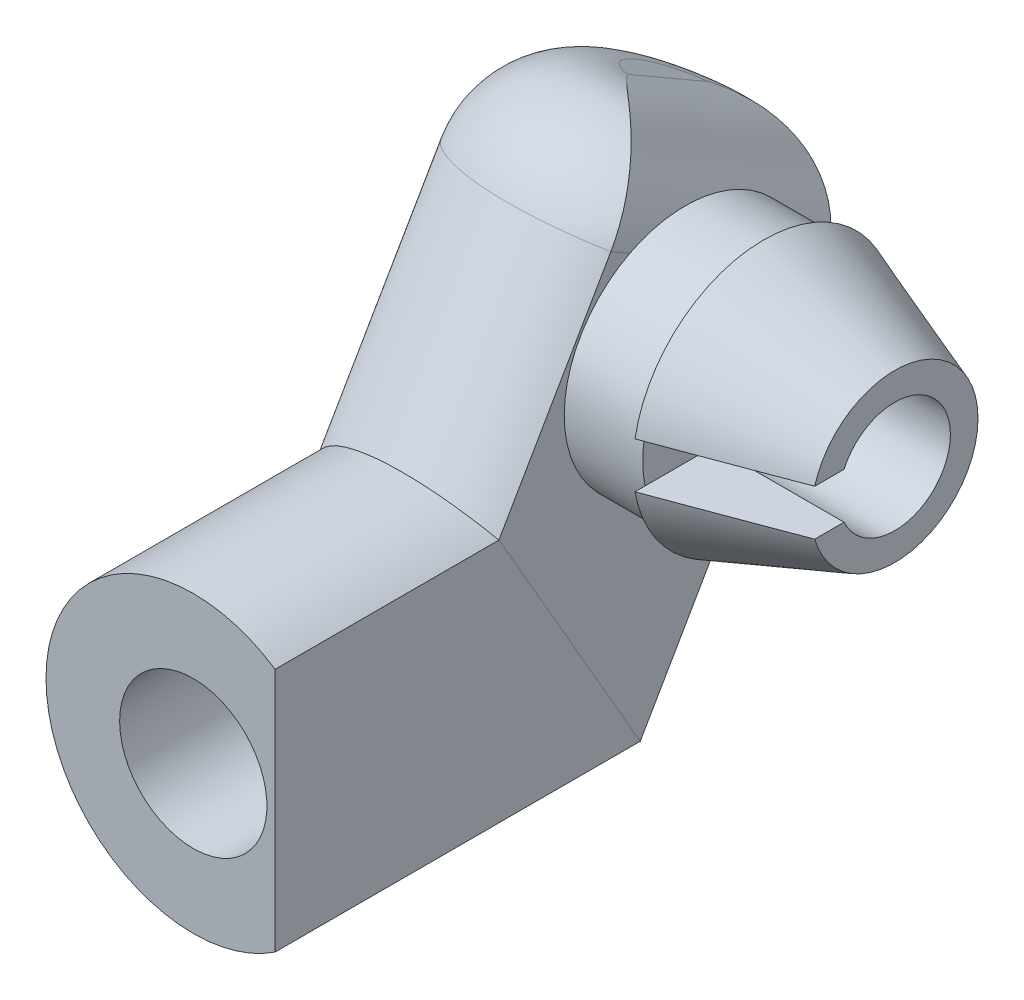
ISO-10303-21;
HEADER;
FILE_DESCRIPTION(('STEP AP214'),'2;1');
FILE_NAME('part.step','',(''),(''),'','','');
FILE_SCHEMA(('AUTOMOTIVE_DESIGN { 1 0 10303 214 1 1 1 1 }'));
ENDSEC;
DATA;
#1=APPLICATION_CONTEXT('core data for automotive mechanical design processes');
#2=APPLICATION_PROTOCOL_DEFINITION('international standard','automotive_design',2000,#1);
#3=PRODUCT_CONTEXT('',#1,'mechanical');
#4=PRODUCT('Part','Part','',(#3));
#5=PRODUCT_RELATED_PRODUCT_CATEGORY('part','',(#4));
#6=PRODUCT_DEFINITION_FORMATION('','',#4);
#7=PRODUCT_DEFINITION_CONTEXT('part definition',#1,'design');
#8=PRODUCT_DEFINITION('design','',#6,#7);
#9=PRODUCT_DEFINITION_SHAPE('','',#8);
#10=(LENGTH_UNIT() NAMED_UNIT(*) SI_UNIT(.MILLI.,.METRE.));
#11=(NAMED_UNIT(*) PLANE_ANGLE_UNIT() SI_UNIT($,.RADIAN.));
#12=(NAMED_UNIT(*) SI_UNIT($,.STERADIAN.) SOLID_ANGLE_UNIT());
#13=UNCERTAINTY_MEASURE_WITH_UNIT(LENGTH_MEASURE(1.E-05),#10,'distance_accuracy_value','');
#14=(GEOMETRIC_REPRESENTATION_CONTEXT(3) GLOBAL_UNCERTAINTY_ASSIGNED_CONTEXT((#13)) GLOBAL_UNIT_ASSIGNED_CONTEXT((#10,
#11,#12)) REPRESENTATION_CONTEXT('',''));
#15=CARTESIAN_POINT('',(0.,0.,0.));
#16=DIRECTION('',(0.,0.,1.));
#17=DIRECTION('',(1.,0.,0.));
#18=AXIS2_PLACEMENT_3D('',#15,#16,#17);
#19=CARTESIAN_POINT('',(-0.0500000000000001,3.02067456655205,-6.26803817760076));
#20=DIRECTION('',(-1.,0.,0.));
#21=DIRECTION('',(0.,0.,1.));
#22=AXIS2_PLACEMENT_3D('',#19,#20,#21);
#23=CONICAL_SURFACE('',#22,2.,0.349065850398867);
#24=CARTESIAN_POINT('',(-2.77462654516506,3.37067456655205,-3.29689917972266));
#25=CARTESIAN_POINT('',(-2.42327258892563,3.37067456655205,-3.42568369624412));
#26=CARTESIAN_POINT('',(-2.07194484779826,3.37067456655205,-3.55454031733741));
#27=CARTESIAN_POINT('',(-1.36933652030103,3.37067456655205,-3.81259219044382));
#28=CARTESIAN_POINT('',(-1.01805595625871,3.37067456655205,-3.9417875032339));
#29=CARTESIAN_POINT('',(-0.320755588125465,3.37067456655205,-4.19878810936494));
#30=CARTESIAN_POINT('',(0.0252667747236861,3.37067456655205,-4.32658645903285));
#31=CARTESIAN_POINT('',(0.716947069285238,3.37067456655205,-4.58297075605418));
#32=CARTESIAN_POINT('',(1.06260505689295,3.37067456655205,-4.71155655220202));
#33=CARTESIAN_POINT('',(1.57423764545681,3.37067456655205,-4.903302441866));
#34=CARTESIAN_POINT('',(1.74045362915212,3.37067456655205,-4.96581761402559));
#35=CARTESIAN_POINT('',(2.07273006817565,3.37067456655205,-5.09148460394503));
#36=CARTESIAN_POINT('',(2.23879042034326,3.37067456655205,-5.15463669461088));
#37=CARTESIAN_POINT('',(2.57206401364978,3.37067456655205,-5.282492884111));
#38=CARTESIAN_POINT('',(2.73927384959226,3.37067456655205,-5.34720590724439));
#39=CARTESIAN_POINT('',(2.9894349409236,3.37067456655205,-5.44559387680397));
#40=CARTESIAN_POINT('',(3.07265427580025,3.37067456655205,-5.47858575646397));
#41=CARTESIAN_POINT('',(3.2388235912935,3.37067456655205,-5.54523005579115));
#42=CARTESIAN_POINT('',(3.32177358518172,3.37067456655205,-5.57888244231845));
#43=CARTESIAN_POINT('',(3.4874112070593,3.37067456655205,-5.64723040605564));
#44=CARTESIAN_POINT('',(3.57009814885906,3.37067456655205,-5.68192766018844));
#45=CARTESIAN_POINT('',(3.69377870277282,3.37067456655205,-5.73527374953911));
#46=CARTESIAN_POINT('',(3.73503491387753,3.37067456655205,-5.75331237684576));
#47=CARTESIAN_POINT('',(3.817284757096,3.37067456655205,-5.78994035317764));
#48=CARTESIAN_POINT('',(3.85827847972579,3.37067456655205,-5.80852949837127));
#49=CARTESIAN_POINT('',(3.9395704272291,3.37067456655205,-5.846317114133));
#50=CARTESIAN_POINT('',(3.97987160149362,3.37067456655205,-5.8655091854921));
#51=CARTESIAN_POINT('',(4.0599880505479,3.37067456655205,-5.9050212650404));
#52=CARTESIAN_POINT('',(4.09980257324385,3.37067456655205,-5.92534280187353));
#53=CARTESIAN_POINT('',(4.17825835181021,3.37067456655205,-5.96753280145386));
#54=CARTESIAN_POINT('',(4.21690604754658,3.37067456655205,-5.98938889887413));
#55=CARTESIAN_POINT('',(4.27348651661276,3.37067456655205,-6.0243470330819));
#56=CARTESIAN_POINT('',(4.29209482330612,3.37067456655205,-6.03634746848563));
#57=CARTESIAN_POINT('',(4.32860163615551,3.37067456655205,-6.06137530225531));
#58=CARTESIAN_POINT('',(4.34650067069913,3.37067456655205,-6.07440191367749));
#59=CARTESIAN_POINT('',(4.37266762940358,3.37067456655205,-6.0952438020877));
#60=CARTESIAN_POINT('',(4.38137347883515,3.37067456655205,-6.10250047099872));
#61=CARTESIAN_POINT('',(4.39834568911806,3.37067456655205,-6.11751342505952));
#62=CARTESIAN_POINT('',(4.40661153645898,3.37067456655205,-6.12527027158118));
#63=CARTESIAN_POINT('',(4.43036122700317,3.37067456655205,-6.14931373814886));
#64=CARTESIAN_POINT('',(4.44502118904501,3.37067456655205,-6.16654028836408));
#65=CARTESIAN_POINT('',(4.46151129646433,3.37067456655205,-6.19272675923471));
#66=CARTESIAN_POINT('',(4.4656643047225,3.37067456655205,-6.20019908811757));
#67=CARTESIAN_POINT('',(4.47286224188125,3.37067456655205,-6.21567538133807));
#68=CARTESIAN_POINT('',(4.47590720160265,3.37067456655205,-6.22367933088114));
#69=CARTESIAN_POINT('',(4.4805723080935,3.37067456655205,-6.24022212777529));
#70=CARTESIAN_POINT('',(4.48217325211873,3.37067456655205,-6.24876661200323));
#71=CARTESIAN_POINT('',(4.48361123583205,3.37067456655205,-6.26599963561359));
#72=CARTESIAN_POINT('',(4.48345061030803,3.37067456655205,-6.27468796908174));
#73=CARTESIAN_POINT('',(4.4815532706528,3.37067456655205,-6.29060394083571));
#74=CARTESIAN_POINT('',(4.48004782931275,3.37067456655205,-6.29786112221742));
#75=CARTESIAN_POINT('',(4.4759551246222,3.37067456655205,-6.31206214229679));
#76=CARTESIAN_POINT('',(4.47336682262463,3.37067456655205,-6.31900567304669));
#77=CARTESIAN_POINT('',(4.46535972694491,3.37067456655205,-6.33692216003942));
#78=CARTESIAN_POINT('',(4.45919710046404,3.37067456655205,-6.34755822343045));
#79=CARTESIAN_POINT('',(4.44538949320498,3.37067456655205,-6.36781845957667));
#80=CARTESIAN_POINT('',(4.43773925250148,3.37067456655205,-6.37743884917097));
#81=CARTESIAN_POINT('',(4.41771854908501,3.37067456655205,-6.40014850378801));
#82=CARTESIAN_POINT('',(4.40481281814124,3.37067456655205,-6.4127581723934));
#83=CARTESIAN_POINT('',(4.37788317812015,3.37067456655205,-6.43673855036823));
#84=CARTESIAN_POINT('',(4.36385657075129,3.37067456655205,-6.44810610390274));
#85=CARTESIAN_POINT('',(4.3350301514679,3.37067456655205,-6.47000930524335));
#86=CARTESIAN_POINT('',(4.32022590152338,3.37067456655205,-6.48053905738128));
#87=CARTESIAN_POINT('',(4.29018172422201,3.37067456655205,-6.50090657979079));
#88=CARTESIAN_POINT('',(4.2749423670518,3.37067456655205,-6.5107452020479));
#89=CARTESIAN_POINT('',(4.22460752621657,3.37067456655205,-6.54208686697669));
#90=CARTESIAN_POINT('',(4.18886345247389,3.37067456655205,-6.56254269267113));
#91=CARTESIAN_POINT('',(4.11654066960701,3.37067456655205,-6.60193216218318));
#92=CARTESIAN_POINT('',(4.0799614366747,3.37067456655205,-6.62086481501814));
#93=CARTESIAN_POINT('',(4.00622513665027,3.37067456655205,-6.65774948835564));
#94=CARTESIAN_POINT('',(3.96906709358234,3.37067456655205,-6.67569955292643));
#95=CARTESIAN_POINT('',(3.8944141347352,3.37067456655205,-6.71088727210513));
#96=CARTESIAN_POINT('',(3.85691919061602,3.37067456655205,-6.72812486608421));
#97=CARTESIAN_POINT('',(3.74425023757635,3.37067456655205,-6.77899353817693));
#98=CARTESIAN_POINT('',(3.66873116577695,3.37067456655205,-6.81185852034386));
#99=CARTESIAN_POINT('',(3.51727780296116,3.37067456655205,-6.87634609856422));
#100=CARTESIAN_POINT('',(3.44134411964462,3.37067456655205,-6.90797013949984));
#101=CARTESIAN_POINT('',(3.21402014676534,3.37067456655205,-7.00130223386729));
#102=CARTESIAN_POINT('',(3.06216634023453,3.37067456655205,-7.06187870590303));
#103=CARTESIAN_POINT('',(2.75787483568222,3.37067456655205,-7.18155314886679));
#104=CARTESIAN_POINT('',(2.60543710656806,3.37067456655205,-7.24065103976518));
#105=CARTESIAN_POINT('',(2.30013700556098,3.37067456655205,-7.35799817813714));
#106=CARTESIAN_POINT('',(2.14727444339837,3.37067456655205,-7.41624693084861));
#107=CARTESIAN_POINT('',(1.84134250341777,3.37067456655205,-7.53218645476202));
#108=CARTESIAN_POINT('',(1.68827313043809,3.37067456655205,-7.58987723876851));
#109=CARTESIAN_POINT('',(1.22906188063726,3.37067456655205,-7.76232047213126));
#110=CARTESIAN_POINT('',(0.922713029999243,3.37067456655205,-7.87652147033408));
#111=CARTESIAN_POINT('',(0.309789353610408,3.37067456655205,-8.10415745068491));
#112=CARTESIAN_POINT('',(0.00321457364096272,3.37067456655205,-8.21759255646171));
#113=CARTESIAN_POINT('',(-0.419257648315761,3.37067456655205,-8.37355671615143));
#114=CARTESIAN_POINT('',(-0.535083549104995,3.37067456655205,-8.41627955675354));
#115=CARTESIAN_POINT('',(-0.766759649561241,3.37067456655205,-8.50167204948504));
#116=CARTESIAN_POINT('',(-0.882609849948039,3.37067456655205,-8.54434169966138));
#117=CARTESIAN_POINT('',(-1.1143499201964,3.37067456655205,-8.62964347735423));
#118=CARTESIAN_POINT('',(-1.23023979337941,3.37067456655205,-8.67227559584663));
#119=CARTESIAN_POINT('',(-1.46202987497103,3.37067456655205,-8.75749887203897));
#120=CARTESIAN_POINT('',(-1.57793008285892,3.37067456655205,-8.80009003115512));
#121=CARTESIAN_POINT('',(-1.6938363368945,3.37067456655205,-8.84266472276581));
#122=B_SPLINE_CURVE_WITH_KNOTS('',3,(#24,#25,#26,#27,#28,#29,#30,#31,#32,#33,#34,#35,#36,#37,
#38,#39,#40,#41,#42,#43,#44,#45,#46,#47,#48,#49,#50,#51,#52,#53,#54,#55,#56,#57,#58,#59,#60,#61,
#62,#63,#64,#65,#66,#67,#68,#69,#70,#71,#72,#73,#74,#75,#76,#77,#78,#79,#80,#81,#82,#83,#84,#85,
#86,#87,#88,#89,#90,#91,#92,#93,#94,#95,#96,#97,#98,#99,#100,#101,#102,#103,#104,#105,#106,#107,
#108,#109,#110,#111,#112,#113,#114,#115,#116,#117,#118,#119,#120,#121),.UNSPECIFIED.,.F.,.F.,(4,
2,2,2,2,2,2,2,2,2,2,2,2,2,2,2,2,2,2,2,2,2,2,2,2,2,2,2,2,2,2,2,2,2,2,2,2,2,2,2,2,2,2,2,2,2,2,2,
4),(0.,1.12263806213981,2.24549365242548,3.35209854764365,4.45849722864678,4.99124687229742,
5.52423540417691,6.062115199719,6.33067467625493,6.59922071252585,6.86822349511738,
7.00330268339706,7.13833246836919,7.27223251501375,7.40631842015282,7.53942623766793,
7.60583202066936,7.6721873657419,7.7061654602934,7.7401823771049,7.80737994648006,
7.83296116780216,7.858541677518,7.88445754946419,7.91033907661649,7.93247794617937,
7.95463809953548,7.9913009775169,8.02809592644254,8.08208385071837,8.1362058998831,
8.19068018438077,8.24508609277228,8.36855612367371,8.4921058457832,8.61589317326353,
8.73969101302797,8.98675034894229,9.23351292816836,9.72396241558983,10.214438391882,
10.7051895647521,11.1959294487619,12.1767548109269,13.1574178719132,13.5277797362733,
13.8981548210872,14.2686027073961,14.6390372882699),.UNSPECIFIED.);
#123=CARTESIAN_POINT('',(-0.0500000000000001,3.37067456655205,-4.29890131084923));
#124=VERTEX_POINT('',#123);
#125=CARTESIAN_POINT('',(1.95,3.37067456655205,-5.04507642366176));
#126=VERTEX_POINT('',#125);
#127=EDGE_CURVE('E144',#124,#126,#122,.T.);
#128=ORIENTED_EDGE('',*,*,#127,.T.);
#129=CARTESIAN_POINT('',(1.95,3.02067456655205,-6.26803817760076));
#130=DIRECTION('',(-1.,0.,0.));
#131=DIRECTION('',(0.,0.,1.));
#132=AXIS2_PLACEMENT_3D('',#129,#130,#131);
#133=CIRCLE('',#132,1.27205953146759);
#134=CARTESIAN_POINT('',(1.95,2.67067456655205,-5.04507642366176));
#135=VERTEX_POINT('',#134);
#136=EDGE_CURVE('E136',#126,#135,#133,.T.);
#137=ORIENTED_EDGE('',*,*,#136,.T.);
#138=CARTESIAN_POINT('',(-1.6938363368945,2.67067456655205,-8.84266472276581));
#139=CARTESIAN_POINT('',(-1.39084312010366,2.67067456655205,-8.73134954304294));
#140=CARTESIAN_POINT('',(-1.0878799204241,2.67067456655205,-8.61995177955954));
#141=CARTESIAN_POINT('',(-0.482072147912954,2.67067456655205,-8.39679366705519));
#142=CARTESIAN_POINT('',(-0.179227580821663,2.67067456655205,-8.28503330245616));
#143=CARTESIAN_POINT('',(0.426045713999038,2.67067456655205,-8.06104076641011));
#144=CARTESIAN_POINT('',(0.728474584413828,2.67067456655205,-7.9488089806108));
#145=CARTESIAN_POINT('',(1.33296707437697,2.67067456655205,-7.72339462720753));
#146=CARTESIAN_POINT('',(1.635030706299,2.67067456655205,-7.61021209290803));
#147=CARTESIAN_POINT('',(2.08147336611564,2.67067456655205,-7.44123951195269));
#148=CARTESIAN_POINT('',(2.2261435697162,2.67067456655205,-7.38622026529084));
#149=CARTESIAN_POINT('',(2.51521538515,2.67067456655205,-7.27544993228132));
#150=CARTESIAN_POINT('',(2.65961697722051,2.67067456655205,-7.21969879434197));
#151=CARTESIAN_POINT('',(2.94809691982126,2.67067456655205,-7.10697656778773));
#152=CARTESIAN_POINT('',(3.09217486219859,2.67067456655205,-7.05000442585688));
#153=CARTESIAN_POINT('',(3.30761590597137,2.67067456655205,-6.96289530653683));
#154=CARTESIAN_POINT('',(3.37931286905276,2.67067456655205,-6.93358550248316));
#155=CARTESIAN_POINT('',(3.52236947089667,2.67067456655205,-6.87415553342811));
#156=CARTESIAN_POINT('',(3.59372912163667,2.67067456655205,-6.84403539745846));
#157=CARTESIAN_POINT('',(3.70184301069918,2.67067456655205,-6.7972723056344));
#158=CARTESIAN_POINT('',(3.73879495421952,2.67067456655205,-6.78108706080138));
#159=CARTESIAN_POINT('',(3.81250272904556,2.67067456655205,-6.74826801771159));
#160=CARTESIAN_POINT('',(3.8492585469722,2.67067456655205,-6.7316341893109));
#161=CARTESIAN_POINT('',(3.92241867717479,2.67067456655205,-6.69780515008198));
#162=CARTESIAN_POINT('',(3.95882356464266,2.67067456655205,-6.68061118870708));
#163=CARTESIAN_POINT('',(4.03122986583517,2.67067456655205,-6.64540103744479));
#164=CARTESIAN_POINT('',(4.06723133555357,2.67067456655205,-6.62738496347115));
#165=CARTESIAN_POINT('',(4.13254312905149,2.67067456655205,-6.59330726983415));
#166=CARTESIAN_POINT('',(4.16195054648732,2.67067456655205,-6.57743402641721));
#167=CARTESIAN_POINT('',(4.22019759339902,2.67067456655205,-6.54440130409489));
#168=CARTESIAN_POINT('',(4.24903433066575,2.67067456655205,-6.52723671892937));
#169=CARTESIAN_POINT('',(4.30582086405083,2.67067456655205,-6.49082897159652));
#170=CARTESIAN_POINT('',(4.33375943706807,2.67067456655205,-6.47156737527978));
#171=CARTESIAN_POINT('',(4.3736125756873,2.67067456655205,-6.44018193645929));
#172=CARTESIAN_POINT('',(4.38652292958858,2.67067456655205,-6.4293366792541));
#173=CARTESIAN_POINT('',(4.41125163155341,2.67067456655205,-6.40647961225138));
#174=CARTESIAN_POINT('',(4.42307262606197,2.67067456655205,-6.39447078319664));
#175=CARTESIAN_POINT('',(4.4406818876395,2.67067456655205,-6.37370428377566));
#176=CARTESIAN_POINT('',(4.4470541302998,2.67067456655205,-6.36544824971971));
#177=CARTESIAN_POINT('',(4.45871183783143,2.67067456655205,-6.3481905668934));
#178=CARTESIAN_POINT('',(4.46399860837974,2.67067456655205,-6.33918983240839));
#179=CARTESIAN_POINT('',(4.47196897113238,2.67067456655205,-6.32249194947064));
#180=CARTESIAN_POINT('',(4.47496995041825,2.67067456655205,-6.31494936339838));
#181=CARTESIAN_POINT('',(4.47969660558309,2.67067456655205,-6.29947464639134));
#182=CARTESIAN_POINT('',(4.48142442557921,2.67067456655205,-6.29154319448523));
#183=CARTESIAN_POINT('',(4.48337902746635,2.67067456655205,-6.27542610202916));
#184=CARTESIAN_POINT('',(4.4835938859242,2.67067456655205,-6.26723895198931));
#185=CARTESIAN_POINT('',(4.48245545691559,2.67067456655205,-6.25097381368917));
#186=CARTESIAN_POINT('',(4.48110098729938,2.67067456655205,-6.24289591236394));
#187=CARTESIAN_POINT('',(4.47670698896403,2.67067456655205,-6.22587146402327));
#188=CARTESIAN_POINT('',(4.47343756844832,2.67067456655205,-6.21698597239738));
#189=CARTESIAN_POINT('',(4.46553335331852,2.67067456655205,-6.199847891973));
#190=CARTESIAN_POINT('',(4.46089543821005,2.67067456655205,-6.19159680457255));
#191=CARTESIAN_POINT('',(4.44649281227225,2.67067456655205,-6.16921607051389));
#192=CARTESIAN_POINT('',(4.43563861536566,2.67067456655205,-6.1558015259438));
#193=CARTESIAN_POINT('',(4.41227892723717,2.67067456655205,-6.13051007224804));
#194=CARTESIAN_POINT('',(4.39976741006309,2.67067456655205,-6.11863910353553));
#195=CARTESIAN_POINT('',(4.36174316914776,2.67067456655205,-6.08544754621736));
#196=CARTESIAN_POINT('',(4.33495998067285,2.67067456655205,-6.06560533083626));
#197=CARTESIAN_POINT('',(4.27987921174937,2.67067456655205,-6.02811381899336));
#198=CARTESIAN_POINT('',(4.25157729812597,2.67067456655205,-6.01047133292898));
#199=CARTESIAN_POINT('',(4.19398038306806,2.67067456655205,-5.97650106755176));
#200=CARTESIAN_POINT('',(4.16468070335352,2.67067456655205,-5.96018121401543));
#201=CARTESIAN_POINT('',(4.1056203844577,2.67067456655205,-5.92852729865799));
#202=CARTESIAN_POINT('',(4.07586052276564,2.67067456655205,-5.91319176060572));
#203=CARTESIAN_POINT('',(3.98691249218305,2.67067456655205,-5.86860756179636));
#204=CARTESIAN_POINT('',(3.92724097437556,2.67067456655205,-5.84032653559506));
#205=CARTESIAN_POINT('',(3.80721795378761,2.67067456655205,-5.78523918369259));
#206=CARTESIAN_POINT('',(3.74686629678557,2.67067456655205,-5.75843320090708));
#207=CARTESIAN_POINT('',(3.62568135821397,2.67067456655205,-5.70575199813877));
#208=CARTESIAN_POINT('',(3.56484762785507,2.67067456655205,-5.6798778119148));
#209=CARTESIAN_POINT('',(3.44290432111213,2.67067456655205,-5.6287864936964));
#210=CARTESIAN_POINT('',(3.38179473686487,2.67067456655205,-5.60356938057239));
#211=CARTESIAN_POINT('',(3.19885219229351,2.67067456655205,-5.52888789110468));
#212=CARTESIAN_POINT('',(3.07673954311407,2.67067456655205,-5.4801097069408));
#213=CARTESIAN_POINT('',(2.83217288323614,2.67067456655205,-5.38362327154868));
#214=CARTESIAN_POINT('',(2.70971909701614,2.67067456655205,-5.33591444706019));
#215=CARTESIAN_POINT('',(2.36577925006676,2.67067456655205,-5.20296661326993));
#216=CARTESIAN_POINT('',(2.14400826672844,2.67067456655205,-5.11846552115047));
#217=CARTESIAN_POINT('',(1.70006500255151,2.67067456655205,-4.95052132688701));
#218=CARTESIAN_POINT('',(1.47789271635705,2.67067456655205,-4.8670782389843));
#219=CARTESIAN_POINT('',(1.03324857569319,2.67067456655205,-4.70080066222643));
#220=CARTESIAN_POINT('',(0.810776654076212,2.67067456655205,-4.61796635290466));
#221=CARTESIAN_POINT('',(0.365686435419268,2.67067456655205,-4.45269638245088));
#222=CARTESIAN_POINT('',(0.143068139218796,2.67067456655205,-4.37026071905479));
#223=CARTESIAN_POINT('',(-0.304085865699287,2.67067456655205,-4.20498714658207));
#224=CARTESIAN_POINT('',(-0.528622391150626,2.67067456655205,-4.12215144760511));
#225=CARTESIAN_POINT('',(-0.977766935318174,2.67067456655205,-3.95667285059932));
#226=CARTESIAN_POINT('',(-1.20237495417011,2.67067456655205,-3.87402995293902));
#227=CARTESIAN_POINT('',(-1.65156839202994,2.67067456655205,-3.70891208277494));
#228=CARTESIAN_POINT('',(-1.87615379395129,2.67067456655205,-3.62643706377938));
#229=CARTESIAN_POINT('',(-2.32536371182025,2.67067456655205,-3.46159518674461));
#230=CARTESIAN_POINT('',(-2.54998822767774,2.67067456655205,-3.37922832845982));
#231=CARTESIAN_POINT('',(-2.77462654516506,2.67067456655205,-3.29689917972265));
#232=B_SPLINE_CURVE_WITH_KNOTS('',3,(#138,#139,#140,#141,#142,#143,#144,#145,#146,#147,#148,
#149,#150,#151,#152,#153,#154,#155,#156,#157,#158,#159,#160,#161,#162,#163,#164,#165,#166,#167,
#168,#169,#170,#171,#172,#173,#174,#175,#176,#177,#178,#179,#180,#181,#182,#183,#184,#185,#186,
#187,#188,#189,#190,#191,#192,#193,#194,#195,#196,#197,#198,#199,#200,#201,#202,#203,#204,#205,
#206,#207,#208,#209,#210,#211,#212,#213,#214,#215,#216,#217,#218,#219,#220,#221,#222,#223,#224,
#225,#226,#227,#228,#229,#230,#231),.UNSPECIFIED.,.F.,.F.,(4,2,2,2,2,2,2,2,2,2,2,2,2,2,2,2,2,2,
2,2,2,2,2,2,2,2,2,2,2,2,2,2,2,2,2,2,2,2,2,2,2,2,2,2,2,2,4),(0.,0.968382454714598,
1.9368070790998,2.90455285023166,3.87226486171529,4.3366008483604,4.80096974412509,
5.26575678706746,5.49812378282166,5.73048246462772,5.85150378381233,5.97253325575116,
6.09330910366149,6.21406797508505,6.31429873760422,6.41494908511096,6.51656922772763,
6.56711167074279,6.61752789931235,6.64876023126615,6.67995477193963,6.70421988325842,
6.72844403591653,6.75285888413178,6.77729213562579,6.80553668306737,6.8338461391956,
6.88532299091197,6.93699242951439,7.03671165951581,7.13673233535448,7.2373137982488,
7.33774070798244,7.53579785032573,7.73390084380829,7.93221724115889,8.13053932767076,
8.52501238387822,8.91926865359183,9.63123415100671,10.3432092216947,11.0553864510623,
11.7675596309265,12.4855467078111,13.2035351559641,13.9212861845747,14.6390355807284),.UNSPECIFIED.);
#233=CARTESIAN_POINT('',(-0.0500000000000001,2.67067456655205,-4.29890131084923));
#234=VERTEX_POINT('',#233);
#235=EDGE_CURVE('E271',#135,#234,#232,.T.);
#236=ORIENTED_EDGE('',*,*,#235,.T.);
#237=CARTESIAN_POINT('',(-0.0500000000000001,3.02067456655205,-6.26803817760076));
#238=DIRECTION('',(-1.,0.,0.));
#239=DIRECTION('',(0.,0.,1.));
#240=AXIS2_PLACEMENT_3D('',#237,#238,#239);
#241=CIRCLE('',#240,2.);
#242=EDGE_CURVE('E147',#124,#234,#241,.T.);
#243=ORIENTED_EDGE('',*,*,#242,.F.);
#244=EDGE_LOOP('',(#128,#137,#236,#243));
#245=FACE_BOUND('',#244,.T.);
#246=ADVANCED_FACE('F39',(#245),#23,.T.);
#247=CARTESIAN_POINT('',(1.95,3.02067456655205,-6.26803817760076));
#248=DIRECTION('',(1.,0.,0.));
#249=DIRECTION('',(0.,0.,1.));
#250=AXIS2_PLACEMENT_3D('',#247,#248,#249);
#251=PLANE('',#250);
#252=CARTESIAN_POINT('',(1.95,3.02067456655205,-6.26803817760076));
#253=DIRECTION('',(-1.,0.,0.));
#254=DIRECTION('',(0.,0.,1.));
#255=AXIS2_PLACEMENT_3D('',#252,#253,#254);
#256=CIRCLE('',#255,0.85);
#257=CARTESIAN_POINT('',(1.95,3.37067456655205,-5.49344150835927));
#258=VERTEX_POINT('',#257);
#259=CARTESIAN_POINT('',(1.95,2.67067456655205,-5.49344150835927));
#260=VERTEX_POINT('',#259);
#261=EDGE_CURVE('E134',#258,#260,#256,.T.);
#262=ORIENTED_EDGE('',*,*,#261,.T.);
#263=DIRECTION('',(0.,0.,1.));
#264=VECTOR('',#263,1.);
#265=CARTESIAN_POINT('',(1.95,2.67067456655205,-6.11803817760075));
#266=LINE('',#265,#264);
#267=EDGE_CURVE('E138',#260,#135,#266,.T.);
#268=ORIENTED_EDGE('',*,*,#267,.T.);
#269=ORIENTED_EDGE('',*,*,#136,.F.);
#270=DIRECTION('',(0.,0.,1.));
#271=VECTOR('',#270,1.);
#272=CARTESIAN_POINT('',(1.95,3.37067456655205,-6.11803817760075));
#273=LINE('',#272,#271);
#274=EDGE_CURVE('E124',#258,#126,#273,.T.);
#275=ORIENTED_EDGE('',*,*,#274,.F.);
#276=EDGE_LOOP('',(#262,#268,#269,#275));
#277=FACE_BOUND('',#276,.T.);
#278=ADVANCED_FACE('F133',(#277),#251,.T.);
#279=CARTESIAN_POINT('',(-0.0500000000000001,3.02067456655205,-6.26803817760076));
#280=DIRECTION('',(1.,0.,0.));
#281=DIRECTION('',(0.,0.,1.));
#282=AXIS2_PLACEMENT_3D('',#279,#280,#281);
#283=PLANE('',#282);
#284=DIRECTION('',(0.,0.,1.));
#285=VECTOR('',#284,1.);
#286=CARTESIAN_POINT('',(-0.0500000000000001,3.37067456655205,-6.11803817760075));
#287=LINE('',#286,#285);
#288=CARTESIAN_POINT('',(-0.0500000000000001,3.37067456655205,-4.45144796514226));
#289=VERTEX_POINT('',#288);
#290=EDGE_CURVE('E302',#289,#124,#287,.T.);
#291=ORIENTED_EDGE('',*,*,#290,.T.);
#292=ORIENTED_EDGE('',*,*,#242,.T.);
#293=DIRECTION('',(0.,0.,1.));
#294=VECTOR('',#293,1.);
#295=CARTESIAN_POINT('',(-0.0500000000000001,2.67067456655205,-6.11803817760075));
#296=LINE('',#295,#294);
#297=CARTESIAN_POINT('',(-0.0500000000000001,2.67067456655205,-4.45144796514226));
#298=VERTEX_POINT('',#297);
#299=EDGE_CURVE('E310',#298,#234,#296,.T.);
#300=ORIENTED_EDGE('',*,*,#299,.F.);
#301=CARTESIAN_POINT('',(-0.0500000000000001,3.02067456655205,-6.26803817760076));
#302=DIRECTION('',(-1.,0.,0.));
#303=DIRECTION('',(0.,0.,1.));
#304=AXIS2_PLACEMENT_3D('',#301,#302,#303);
#305=CIRCLE('',#304,1.85);
#306=EDGE_CURVE('E156',#289,#298,#305,.T.);
#307=ORIENTED_EDGE('',*,*,#306,.F.);
#308=EDGE_LOOP('',(#291,#292,#300,#307));
#309=FACE_BOUND('',#308,.T.);
#310=ADVANCED_FACE('F267',(#309),#283,.F.);
#311=CARTESIAN_POINT('',(-0.45,3.02067456655205,-6.26803817760076));
#312=DIRECTION('',(1.,0.,0.));
#313=DIRECTION('',(0.,0.,1.));
#314=AXIS2_PLACEMENT_3D('',#311,#312,#313);
#315=CYLINDRICAL_SURFACE('',#314,0.85);
#316=CARTESIAN_POINT('',(-0.45,3.02067456655205,-6.26803817760076));
#317=DIRECTION('',(-1.,0.,0.));
#318=DIRECTION('',(0.,0.,1.));
#319=AXIS2_PLACEMENT_3D('',#316,#317,#318);
#320=CIRCLE('',#319,0.85);
#321=CARTESIAN_POINT('',(-0.45,3.02067456655205,-5.41803817760076));
#322=VERTEX_POINT('',#321);
#323=EDGE_CURVE('E143',#322,#322,#320,.T.);
#324=ORIENTED_EDGE('',*,*,#323,.T.);
#325=EDGE_LOOP('',(#324));
#326=FACE_BOUND('',#325,.T.);
#327=DIRECTION('',(1.,0.,0.));
#328=VECTOR('',#327,1.);
#329=CARTESIAN_POINT('',(-0.45,3.37067456655205,-5.49344150835927));
#330=LINE('',#329,#328);
#331=CARTESIAN_POINT('',(-0.0500000000000001,3.37067456655205,-5.49344150835927));
#332=VERTEX_POINT('',#331);
#333=EDGE_CURVE('E11',#258,#332,#330,.F.);
#334=ORIENTED_EDGE('',*,*,#333,.T.);
#335=CARTESIAN_POINT('',(-0.0500000000000001,3.02067456655205,-6.26803817760076));
#336=DIRECTION('',(-1.,0.,0.));
#337=DIRECTION('',(0.,0.,1.));
#338=AXIS2_PLACEMENT_3D('',#335,#336,#337);
#339=CIRCLE('',#338,0.85);
#340=CARTESIAN_POINT('',(-0.0500000000000001,2.67067456655205,-5.49344150835927));
#341=VERTEX_POINT('',#340);
#342=EDGE_CURVE('E48',#332,#341,#339,.F.);
#343=ORIENTED_EDGE('',*,*,#342,.T.);
#344=DIRECTION('',(1.,0.,0.));
#345=VECTOR('',#344,1.);
#346=CARTESIAN_POINT('',(-0.45,2.67067456655205,-5.49344150835927));
#347=LINE('',#346,#345);
#348=EDGE_CURVE('E141',#341,#260,#347,.T.);
#349=ORIENTED_EDGE('',*,*,#348,.T.);
#350=ORIENTED_EDGE('',*,*,#261,.F.);
#351=EDGE_LOOP('',(#334,#343,#349,#350));
#352=FACE_BOUND('',#351,.T.);
#353=ADVANCED_FACE('F140',(#326,#352),#315,.F.);
#354=CARTESIAN_POINT('',(-1.25,-0.804310319560903,-1.87538432102024));
#355=DIRECTION('',(-1.,0.,0.));
#356=DIRECTION('',(0.,0.,-1.));
#357=AXIS2_PLACEMENT_3D('',#354,#355,#356);
#358=PLANE('',#357);
#359=CARTESIAN_POINT('',(-1.25,3.02067456655205,-6.26803817760076));
#360=DIRECTION('',(-1.,0.,0.));
#361=DIRECTION('',(0.,0.,1.));
#362=AXIS2_PLACEMENT_3D('',#359,#360,#361);
#363=CIRCLE('',#362,1.85);
#364=CARTESIAN_POINT('',(-1.25,2.09567456655206,-7.87018517460196));
#365=VERTEX_POINT('',#364);
#366=CARTESIAN_POINT('',(-1.25,4.66491909115015,-5.42012312092989));
#367=VERTEX_POINT('',#366);
#368=EDGE_CURVE('E155',#365,#367,#363,.T.);
#369=ORIENTED_EDGE('',*,*,#368,.T.);
#370=DIRECTION('',(0.,-0.499999999999998,-0.86602540378444));
#371=VECTOR('',#370,1.);
#372=CARTESIAN_POINT('',(-1.25,4.83252866372346,-5.12981482539802));
#373=LINE('',#372,#371);
#374=CARTESIAN_POINT('',(-1.25,4.83252866372346,-5.12981482539802));
#375=VERTEX_POINT('',#374);
#376=EDGE_CURVE('E193',#375,#367,#373,.T.);
#377=ORIENTED_EDGE('',*,*,#376,.F.);
#378=DIRECTION('',(0.,0.86602540378444,-0.499999999999998));
#379=VECTOR('',#378,1.);
#380=CARTESIAN_POINT('',(-1.25,-0.804310319560903,-1.87538432102024));
#381=LINE('',#380,#379);
#382=CARTESIAN_POINT('',(-1.25,1.87082869338697,-3.41987655026535));
#383=VERTEX_POINT('',#382);
#384=EDGE_CURVE('E186',#383,#375,#381,.T.);
#385=ORIENTED_EDGE('',*,*,#384,.F.);
#386=DIRECTION('',(0.,0.866025403784438,0.500000000000001));
#387=VECTOR('',#386,1.);
#388=CARTESIAN_POINT('',(-1.25,3.35167867855522,-2.56490741269901));
#389=LINE('',#388,#387);
#390=CARTESIAN_POINT('',(-1.25,-1.87082869338697,-5.58012344973465));
#391=VERTEX_POINT('',#390);
#392=EDGE_CURVE('E168',#391,#383,#389,.T.);
#393=ORIENTED_EDGE('',*,*,#392,.F.);
#394=DIRECTION('',(0.,0.86602540378444,-0.499999999999998));
#395=VECTOR('',#394,1.);
#396=CARTESIAN_POINT('',(-1.25,-2.67513901294786,-5.11575467022417));
#397=LINE('',#396,#395);
#398=EDGE_CURVE('E177',#391,#365,#397,.T.);
#399=ORIENTED_EDGE('',*,*,#398,.T.);
#400=EDGE_LOOP('',(#369,#377,#385,#393,#399));
#401=FACE_BOUND('',#400,.T.);
#402=ADVANCED_FACE('F227',(#401),#358,.F.);
#403=CARTESIAN_POINT('',(-2.5,5.19615242270664,-7.49999999999998));
#404=DIRECTION('',(0.,-0.86602540378444,0.499999999999998));
#405=DIRECTION('',(-1.,0.,0.));
#406=AXIS2_PLACEMENT_3D('',#403,#404,#405);
#407=PLANE('',#406);
#408=CARTESIAN_POINT('',(-2.5,5.19615242270664,-7.49999999999998));
#409=DIRECTION('',(0.,0.86602540378444,-0.499999999999998));
#410=DIRECTION('',(0.,-0.499999999999998,-0.86602540378444));
#411=AXIS2_PLACEMENT_3D('',#408,#409,#410);
#412=CIRCLE('',#411,0.75);
#413=CARTESIAN_POINT('',(-2.75,5.54970581329991,-6.88762756430419));
#414=VERTEX_POINT('',#413);
#415=CARTESIAN_POINT('',(-2.75,4.84259903211337,-8.11237243569578));
#416=VERTEX_POINT('',#415);
#417=EDGE_CURVE('E196',#414,#416,#412,.F.);
#418=ORIENTED_EDGE('',*,*,#417,.F.);
#419=DIRECTION('',(0.,-0.499999999999998,-0.86602540378444));
#420=VECTOR('',#419,1.);
#421=CARTESIAN_POINT('',(-2.75,5.19615242270664,-7.49999999999998));
#422=LINE('',#421,#420);
#423=EDGE_CURVE('E200',#416,#414,#422,.F.);
#424=ORIENTED_EDGE('',*,*,#423,.F.);
#425=EDGE_LOOP('',(#418,#424));
#426=FACE_BOUND('',#425,.T.);
#427=ADVANCED_FACE('F222',(#426),#407,.F.);
#428=CARTESIAN_POINT('',(-2.5,0.,0.));
#429=DIRECTION('',(0.,0.,1.));
#430=DIRECTION('',(-1.,0.,0.));
#431=AXIS2_PLACEMENT_3D('',#428,#429,#430);
#432=PLANE('',#431);
#433=CARTESIAN_POINT('',(-2.5,0.,0.));
#434=DIRECTION('',(0.,0.,-1.));
#435=DIRECTION('',(-1.,0.,0.));
#436=AXIS2_PLACEMENT_3D('',#433,#434,#435);
#437=CIRCLE('',#436,1.125);
#438=CARTESIAN_POINT('',(-3.625,0.,0.));
#439=VERTEX_POINT('',#438);
#440=EDGE_CURVE('E159',#439,#439,#437,.T.);
#441=ORIENTED_EDGE('',*,*,#440,.T.);
#442=EDGE_LOOP('',(#441));
#443=FACE_BOUND('',#442,.T.);
#444=CARTESIAN_POINT('',(-2.5,0.,0.));
#445=DIRECTION('',(0.,0.,-1.));
#446=DIRECTION('',(-1.,0.,0.));
#447=AXIS2_PLACEMENT_3D('',#444,#445,#446);
#448=CIRCLE('',#447,2.25);
#449=CARTESIAN_POINT('',(-1.25,-1.87082869338697,0.));
#450=VERTEX_POINT('',#449);
#451=CARTESIAN_POINT('',(-1.25,1.87082869338697,0.));
#452=VERTEX_POINT('',#451);
#453=EDGE_CURVE('E173',#450,#452,#448,.T.);
#454=ORIENTED_EDGE('',*,*,#453,.F.);
#455=DIRECTION('',(0.,-1.,0.));
#456=VECTOR('',#455,1.);
#457=CARTESIAN_POINT('',(-1.25,1.87082869338697,0.));
#458=LINE('',#457,#456);
#459=EDGE_CURVE('E176',#452,#450,#458,.T.);
#460=ORIENTED_EDGE('',*,*,#459,.F.);
#461=EDGE_LOOP('',(#454,#460));
#462=FACE_BOUND('',#461,.T.);
#463=ADVANCED_FACE('F226',(#443,#462),#432,.T.);
#464=CARTESIAN_POINT('',(-2.5,-1.73972466625438,-3.49556949562221));
#465=DIRECTION('',(0.,0.86602540378444,-0.499999999999998));
#466=DIRECTION('',(0.,0.499999999999998,0.86602540378444));
#467=AXIS2_PLACEMENT_3D('',#464,#465,#466);
#468=CYLINDRICAL_SURFACE('',#467,2.25);
#469=ORIENTED_EDGE('',*,*,#398,.F.);
#470=CARTESIAN_POINT('',(-2.5,0.,-4.5));
#471=DIRECTION('',(0.,-0.500000000000001,0.866025403784438));
#472=DIRECTION('',(0.,-0.866025403784438,-0.500000000000001));
#473=AXIS2_PLACEMENT_3D('',#470,#471,#472);
#474=ELLIPSE('',#473,2.59807621135332,2.25);
#475=EDGE_CURVE('E172',#383,#391,#474,.T.);
#476=ORIENTED_EDGE('',*,*,#475,.F.);
#477=ORIENTED_EDGE('',*,*,#384,.T.);
#478=CARTESIAN_POINT('',(-2.5,3.89711431702998,-6.74999999999999));
#479=DIRECTION('',(0.,0.86602540378444,-0.499999999999998));
#480=DIRECTION('',(0.,-0.499999999999998,-0.86602540378444));
#481=AXIS2_PLACEMENT_3D('',#478,#479,#480);
#482=CIRCLE('',#481,2.25);
#483=CARTESIAN_POINT('',(-1.25,2.9616999703365,-8.37018517460196));
#484=VERTEX_POINT('',#483);
#485=EDGE_CURVE('E203',#484,#375,#482,.T.);
#486=ORIENTED_EDGE('',*,*,#485,.F.);
#487=EDGE_CURVE('E189',#365,#484,#397,.T.);
#488=ORIENTED_EDGE('',*,*,#487,.F.);
#489=EDGE_LOOP('',(#469,#476,#477,#486,#488));
#490=FACE_BOUND('',#489,.T.);
#491=ADVANCED_FACE('F231',(#490),#468,.T.);
#492=CARTESIAN_POINT('',(-1.25,3.10848084952282,-8.11595323427161));
#493=VERTEX_POINT('',#492);
#494=EDGE_CURVE('E63',#493,#365,#363,.T.);
#495=ORIENTED_EDGE('',*,*,#494,.T.);
#496=ORIENTED_EDGE('',*,*,#487,.T.);
#497=EDGE_CURVE('E171',#493,#484,#373,.T.);
#498=ORIENTED_EDGE('',*,*,#497,.F.);
#499=EDGE_LOOP('',(#495,#496,#498));
#500=FACE_BOUND('',#499,.T.);
#501=ADVANCED_FACE('F233',(#500),#358,.F.);
#502=CARTESIAN_POINT('',(-1.25,1.87082869338697,0.));
#503=DIRECTION('',(-1.,0.,0.));
#504=DIRECTION('',(0.,0.,-1.));
#505=AXIS2_PLACEMENT_3D('',#502,#503,#504);
#506=PLANE('',#505);
#507=DIRECTION('',(0.,0.,-1.));
#508=VECTOR('',#507,1.);
#509=CARTESIAN_POINT('',(-1.25,-1.87082869338697,0.));
#510=LINE('',#509,#508);
#511=EDGE_CURVE('E180',#450,#391,#510,.T.);
#512=ORIENTED_EDGE('',*,*,#511,.T.);
#513=ORIENTED_EDGE('',*,*,#392,.T.);
#514=DIRECTION('',(0.,0.,-1.));
#515=VECTOR('',#514,1.);
#516=CARTESIAN_POINT('',(-1.25,1.87082869338697,0.));
#517=LINE('',#516,#515);
#518=EDGE_CURVE('E178',#452,#383,#517,.T.);
#519=ORIENTED_EDGE('',*,*,#518,.F.);
#520=ORIENTED_EDGE('',*,*,#459,.T.);
#521=EDGE_LOOP('',(#512,#513,#519,#520));
#522=FACE_BOUND('',#521,.T.);
#523=ADVANCED_FACE('F236',(#522),#506,.F.);
#524=CARTESIAN_POINT('',(-2.5,0.,0.));
#525=DIRECTION('',(0.,0.,-1.));
#526=DIRECTION('',(1.,0.,0.));
#527=AXIS2_PLACEMENT_3D('',#524,#525,#526);
#528=CYLINDRICAL_SURFACE('',#527,2.25);
#529=ORIENTED_EDGE('',*,*,#518,.T.);
#530=ORIENTED_EDGE('',*,*,#475,.T.);
#531=ORIENTED_EDGE('',*,*,#511,.F.);
#532=ORIENTED_EDGE('',*,*,#453,.T.);
#533=EDGE_LOOP('',(#529,#530,#531,#532));
#534=FACE_BOUND('',#533,.T.);
#535=ADVANCED_FACE('F220',(#534),#528,.T.);
#536=CARTESIAN_POINT('',(-2.5,3.89711431702998,-6.74999999999999));
#537=DIRECTION('',(0.,-0.86602540378444,0.499999999999998));
#538=DIRECTION('',(0.,-0.499999999999998,-0.86602540378444));
#539=AXIS2_PLACEMENT_3D('',#536,#537,#538);
#540=DEGENERATE_TOROIDAL_SURFACE('',#539,0.75,1.5,.T.);
#541=CARTESIAN_POINT('',(-1.25,2.9616999703365,-8.37018517460196));
#542=CARTESIAN_POINT('',(-1.24999814520697,2.99479987181354,-8.38929473665628));
#543=CARTESIAN_POINT('',(-1.25146190720398,3.02827310512128,-8.40771909432136));
#544=CARTESIAN_POINT('',(-1.25728721405042,3.0957432628677,-8.44307374989157));
#545=CARTESIAN_POINT('',(-1.26164814506539,3.1297400748836,-8.46000436342148));
#546=CARTESIAN_POINT('',(-1.27898256407069,3.23193810336593,-8.50825691182083));
#547=CARTESIAN_POINT('',(-1.29620826332485,3.30060683069265,-8.53718948360161));
#548=CARTESIAN_POINT('',(-1.34118092144037,3.437114660384,-8.5876822704788));
#549=CARTESIAN_POINT('',(-1.36892479964019,3.50495399966777,-8.60924464071501));
#550=CARTESIAN_POINT('',(-1.43367191626777,3.63825290162302,-8.64439350943134));
#551=CARTESIAN_POINT('',(-1.47067875194604,3.70371152841237,-8.65797690241725));
#552=CARTESIAN_POINT('',(-1.55368231178948,3.83296422819545,-8.67705115237366));
#553=CARTESIAN_POINT('',(-1.59993040574105,3.89663659593368,-8.68226698534826));
#554=CARTESIAN_POINT('',(-1.69865694185791,4.01902622294201,-8.68356884724809));
#555=CARTESIAN_POINT('',(-1.75113699271718,4.07774219606577,-8.67965251394676));
#556=CARTESIAN_POINT('',(-1.86541467488915,4.19489437015482,-8.66190901299882));
#557=CARTESIAN_POINT('',(-1.92762472744442,4.25279158575031,-8.64718981376087));
#558=CARTESIAN_POINT('',(-2.05445698157449,4.3618717613418,-8.60707231393778));
#559=CARTESIAN_POINT('',(-2.11908103606492,4.4130494216905,-8.58166564985283));
#560=CARTESIAN_POINT('',(-2.25638493758967,4.51525937312719,-8.51660363132636));
#561=CARTESIAN_POINT('',(-2.32903598928848,4.56543278971332,-8.47553967205553));
#562=CARTESIAN_POINT('',(-2.47017748078667,4.65918926734154,-8.3809494183145));
#563=CARTESIAN_POINT('',(-2.53867240696307,4.70277951319664,-8.32743687460706));
#564=CARTESIAN_POINT('',(-2.65344432171762,4.77697723425207,-8.22152697176461));
#565=CARTESIAN_POINT('',(-2.70131722549737,4.80834933404259,-8.1714075276888));
#566=CARTESIAN_POINT('',(-2.74692478173104,4.84042751800417,-8.11612894617689));
#567=CARTESIAN_POINT('',(-2.74846475953906,4.84151349086549,-8.11425270366045));
#568=CARTESIAN_POINT('',(-2.75,4.84259903211337,-8.11237243569578));
#569=B_SPLINE_CURVE_WITH_KNOTS('',3,(#541,#542,#543,#544,#545,#546,#547,#548,#549,#550,#551,
#552,#553,#554,#555,#556,#557,#558,#559,#560,#561,#562,#563,#564,#565,#566,#567,#568),
.UNSPECIFIED.,.F.,.F.,(4,2,2,2,2,2,2,2,2,2,2,2,2,4),(0.,0.114586572621303,0.229148875079892,
0.457385298715113,0.685554925934998,0.913813300213431,1.14943077072409,1.38510919540159,
1.64281343984222,1.90071972759309,2.19167251062179,2.48230541927415,2.70987022510459,
2.71784769081054),.UNSPECIFIED.);
#570=EDGE_CURVE('E165',#416,#484,#569,.F.);
#571=ORIENTED_EDGE('',*,*,#570,.T.);
#572=ORIENTED_EDGE('',*,*,#485,.T.);
#573=CARTESIAN_POINT('',(-1.25,4.83252866372346,-5.12981482539802));
#574=CARTESIAN_POINT('',(-1.24999814520697,4.86562798065622,-5.14892539991273));
#575=CARTESIAN_POINT('',(-1.25146190720398,4.89832055909647,-5.16870189147151));
#576=CARTESIAN_POINT('',(-1.25728721405042,4.96267366783553,-5.20945543429214));
#577=CARTESIAN_POINT('',(-1.26164814506539,4.99433441526203,-5.23043223038064));
#578=CARTESIAN_POINT('',(-1.27898256407069,5.08722136221437,-5.29481204506335));
#579=CARTESIAN_POINT('',(-1.29620826332485,5.14661206803671,-5.33981462148344));
#580=CARTESIAN_POINT('',(-1.34118092144037,5.2585940190259,-5.43278747637303));
#581=CARTESIAN_POINT('',(-1.36892479964019,5.31118724905815,-5.48075688245063));
#582=CARTESIAN_POINT('',(-1.43367191626777,5.4082765132584,-5.57862268348229));
#583=CARTESIAN_POINT('',(-1.47067875194604,5.45276939004846,-5.62851982068574));
#584=CARTESIAN_POINT('',(-1.55368231178948,5.53391452496038,-5.73091881722741));
#585=CARTESIAN_POINT('',(-1.59993040574105,5.57026775268741,-5.78345278872052));
#586=CARTESIAN_POINT('',(-1.69865694185791,5.63259001166904,-5.88879438391952));
#587=CARTESIAN_POINT('',(-1.75113699271718,5.65855635410228,-5.94160207490329));
#588=CARTESIAN_POINT('',(-1.86541467488914,5.70176611857382,-6.05193058424695));
#589=CARTESIAN_POINT('',(-1.92762472744442,5.71796752590813,-6.10943064338001));
#590=CARTESIAN_POINT('',(-2.05445698157449,5.73776483972076,-6.22395559640305));
#591=CARTESIAN_POINT('',(-2.11908103606492,5.74135085337213,-6.28098008241375));
#592=CARTESIAN_POINT('',(-2.25638493758967,5.73611046822506,-6.40202750614073));
#593=CARTESIAN_POINT('',(-2.32903598928847,5.72563474460962,-6.46601093913441));
#594=CARTESIAN_POINT('',(-2.47017748078668,5.69059542073358,-6.5945015574003));
#595=CARTESIAN_POINT('',(-2.53867240696311,5.66604732138938,-6.65900808952172));
#596=CARTESIAN_POINT('',(-2.65344432171759,5.61142551554316,-6.77622015227991));
#597=CARTESIAN_POINT('',(-2.70131722549728,5.58370685364519,-6.82844890970649));
#598=CARTESIAN_POINT('',(-2.74692478173104,5.55187328975154,-6.8838687226804));
#599=CARTESIAN_POINT('',(-2.74846475953905,5.5507914024993,-6.88574732402434));
#600=CARTESIAN_POINT('',(-2.75,5.54970581329991,-6.88762756430419));
#601=B_SPLINE_CURVE_WITH_KNOTS('',3,(#573,#574,#575,#576,#577,#578,#579,#580,#581,#582,#583,
#584,#585,#586,#587,#588,#589,#590,#591,#592,#593,#594,#595,#596,#597,#598,#599,#600),
.UNSPECIFIED.,.F.,.F.,(4,2,2,2,2,2,2,2,2,2,2,2,2,4),(0.,0.114586572621303,0.229148875079892,
0.457385298715112,0.685554925934997,0.91381330021343,1.14943077072409,1.38510919540159,
1.64281343984222,1.90071972759309,2.1916725106218,2.48230541927415,2.70987022510459,
2.71784769081054),.UNSPECIFIED.);
#602=EDGE_CURVE('E190',#375,#414,#601,.T.);
#603=ORIENTED_EDGE('',*,*,#602,.T.);
#604=ORIENTED_EDGE('',*,*,#417,.T.);
#605=EDGE_LOOP('',(#571,#572,#603,#604));
#606=FACE_BOUND('',#605,.T.);
#607=ADVANCED_FACE('F216',(#606),#540,.T.);
#608=CARTESIAN_POINT('',(-2.75,4.83252866372346,-5.12981482539802));
#609=DIRECTION('',(0.,-0.499999999999998,-0.86602540378444));
#610=DIRECTION('',(0.,0.86602540378444,-0.499999999999998));
#611=AXIS2_PLACEMENT_3D('',#608,#609,#610);
#612=CYLINDRICAL_SURFACE('',#611,1.5);
#613=ORIENTED_EDGE('',*,*,#602,.F.);
#614=ORIENTED_EDGE('',*,*,#376,.T.);
#615=EDGE_CURVE('E197',#367,#493,#373,.T.);
#616=ORIENTED_EDGE('',*,*,#615,.T.);
#617=ORIENTED_EDGE('',*,*,#497,.T.);
#618=ORIENTED_EDGE('',*,*,#570,.F.);
#619=ORIENTED_EDGE('',*,*,#423,.T.);
#620=EDGE_LOOP('',(#613,#614,#616,#617,#618,#619));
#621=FACE_BOUND('',#620,.T.);
#622=ADVANCED_FACE('F41',(#621),#612,.T.);
#623=CARTESIAN_POINT('',(-2.5,0.,-5.7));
#624=DIRECTION('',(0.,0.,1.));
#625=DIRECTION('',(-1.,0.,0.));
#626=AXIS2_PLACEMENT_3D('',#623,#624,#625);
#627=CYLINDRICAL_SURFACE('',#626,1.125);
#628=CARTESIAN_POINT('',(-2.5,0.,-5.7));
#629=DIRECTION('',(0.,0.,-1.));
#630=DIRECTION('',(-1.,0.,0.));
#631=AXIS2_PLACEMENT_3D('',#628,#629,#630);
#632=CIRCLE('',#631,1.125);
#633=CARTESIAN_POINT('',(-3.625,0.,-5.7));
#634=VERTEX_POINT('',#633);
#635=EDGE_CURVE('E162',#634,#634,#632,.T.);
#636=ORIENTED_EDGE('',*,*,#635,.T.);
#637=EDGE_LOOP('',(#636));
#638=FACE_BOUND('',#637,.T.);
#639=ORIENTED_EDGE('',*,*,#440,.F.);
#640=EDGE_LOOP('',(#639));
#641=FACE_BOUND('',#640,.T.);
#642=ADVANCED_FACE('F246',(#638,#641),#627,.F.);
#643=CARTESIAN_POINT('',(-2.5,0.,-5.7));
#644=DIRECTION('',(0.,0.,1.));
#645=DIRECTION('',(-1.,0.,0.));
#646=AXIS2_PLACEMENT_3D('',#643,#644,#645);
#647=PLANE('',#646);
#648=ORIENTED_EDGE('',*,*,#635,.F.);
#649=EDGE_LOOP('',(#648));
#650=FACE_BOUND('',#649,.T.);
#651=ADVANCED_FACE('F249',(#650),#647,.T.);
#652=CARTESIAN_POINT('',(-0.0500000000000001,3.02067456655205,-6.26803817760076));
#653=DIRECTION('',(-1.,0.,0.));
#654=DIRECTION('',(0.,0.,-1.));
#655=AXIS2_PLACEMENT_3D('',#652,#653,#654);
#656=CYLINDRICAL_SURFACE('',#655,1.85);
#657=ORIENTED_EDGE('',*,*,#306,.T.);
#658=CARTESIAN_POINT('',(-0.0500000000000001,3.02067456655205,-6.26803817760076));
#659=DIRECTION('',(-1.,0.,0.));
#660=DIRECTION('',(0.,0.,1.));
#661=AXIS2_PLACEMENT_3D('',#658,#659,#660);
#662=CIRCLE('',#661,1.85);
#663=EDGE_CURVE('E149',#298,#289,#662,.T.);
#664=ORIENTED_EDGE('',*,*,#663,.T.);
#665=EDGE_LOOP('',(#657,#664));
#666=FACE_BOUND('',#665,.T.);
#667=EDGE_CURVE('E160',#367,#493,#363,.T.);
#668=ORIENTED_EDGE('',*,*,#667,.F.);
#669=ORIENTED_EDGE('',*,*,#368,.F.);
#670=ORIENTED_EDGE('',*,*,#494,.F.);
#671=EDGE_LOOP('',(#668,#669,#670));
#672=FACE_BOUND('',#671,.T.);
#673=ADVANCED_FACE('F253',(#666,#672),#656,.T.);
#674=CARTESIAN_POINT('',(-1.25,3.02067456655205,-6.26803817760076));
#675=DIRECTION('',(1.,0.,0.));
#676=DIRECTION('',(0.,0.,1.));
#677=AXIS2_PLACEMENT_3D('',#674,#675,#676);
#678=PLANE('',#677);
#679=ORIENTED_EDGE('',*,*,#615,.F.);
#680=ORIENTED_EDGE('',*,*,#667,.T.);
#681=EDGE_LOOP('',(#679,#680));
#682=FACE_BOUND('',#681,.T.);
#683=ADVANCED_FACE('F257',(#682),#678,.F.);
#684=CARTESIAN_POINT('',(-0.45,3.02067456655205,-6.26803817760076));
#685=DIRECTION('',(1.,0.,0.));
#686=DIRECTION('',(0.,0.,1.));
#687=AXIS2_PLACEMENT_3D('',#684,#685,#686);
#688=PLANE('',#687);
#689=ORIENTED_EDGE('',*,*,#323,.F.);
#690=EDGE_LOOP('',(#689));
#691=FACE_BOUND('',#690,.T.);
#692=ADVANCED_FACE('F261',(#691),#688,.T.);
#693=CARTESIAN_POINT('',(1.95,3.37067456655205,-6.11803817760075));
#694=DIRECTION('',(0.,-1.,0.));
#695=DIRECTION('',(0.,0.,-1.));
#696=AXIS2_PLACEMENT_3D('',#693,#694,#695);
#697=PLANE('',#696);
#698=ORIENTED_EDGE('',*,*,#127,.F.);
#699=ORIENTED_EDGE('',*,*,#290,.F.);
#700=EDGE_CURVE('E127',#332,#289,#287,.T.);
#701=ORIENTED_EDGE('',*,*,#700,.F.);
#702=ORIENTED_EDGE('',*,*,#333,.F.);
#703=ORIENTED_EDGE('',*,*,#274,.T.);
#704=EDGE_LOOP('',(#698,#699,#701,#702,#703));
#705=FACE_BOUND('',#704,.T.);
#706=ADVANCED_FACE('F123',(#705),#697,.T.);
#707=CARTESIAN_POINT('',(-0.0500000000000001,3.37067456655205,-6.11803817760075));
#708=DIRECTION('',(1.,0.,0.));
#709=DIRECTION('',(0.,0.,1.));
#710=AXIS2_PLACEMENT_3D('',#707,#708,#709);
#711=PLANE('',#710);
#712=ORIENTED_EDGE('',*,*,#663,.F.);
#713=EDGE_CURVE('E55',#341,#298,#296,.T.);
#714=ORIENTED_EDGE('',*,*,#713,.F.);
#715=ORIENTED_EDGE('',*,*,#342,.F.);
#716=ORIENTED_EDGE('',*,*,#700,.T.);
#717=EDGE_LOOP('',(#712,#714,#715,#716));
#718=FACE_BOUND('',#717,.T.);
#719=ADVANCED_FACE('F288',(#718),#711,.T.);
#720=CARTESIAN_POINT('',(-0.0500000000000001,2.67067456655205,-6.11803817760075));
#721=DIRECTION('',(0.,1.,0.));
#722=DIRECTION('',(1.,0.,0.));
#723=AXIS2_PLACEMENT_3D('',#720,#721,#722);
#724=PLANE('',#723);
#725=ORIENTED_EDGE('',*,*,#235,.F.);
#726=ORIENTED_EDGE('',*,*,#267,.F.);
#727=ORIENTED_EDGE('',*,*,#348,.F.);
#728=ORIENTED_EDGE('',*,*,#713,.T.);
#729=ORIENTED_EDGE('',*,*,#299,.T.);
#730=EDGE_LOOP('',(#725,#726,#727,#728,#729));
#731=FACE_BOUND('',#730,.T.);
#732=ADVANCED_FACE('F312',(#731),#724,.T.);
#733=CLOSED_SHELL('',(#246,#278,#310,#353,#402,#427,#463,#491,#501,#523,#535,#607,#622,#642,
#651,#673,#683,#692,#706,#719,#732));
#734=MANIFOLD_SOLID_BREP('B2',#733);
#735=ADVANCED_BREP_SHAPE_REPRESENTATION('',(#18,#734),#14);
#736=SHAPE_DEFINITION_REPRESENTATION(#9,#735);
ENDSEC;
END-ISO-10303-21;
